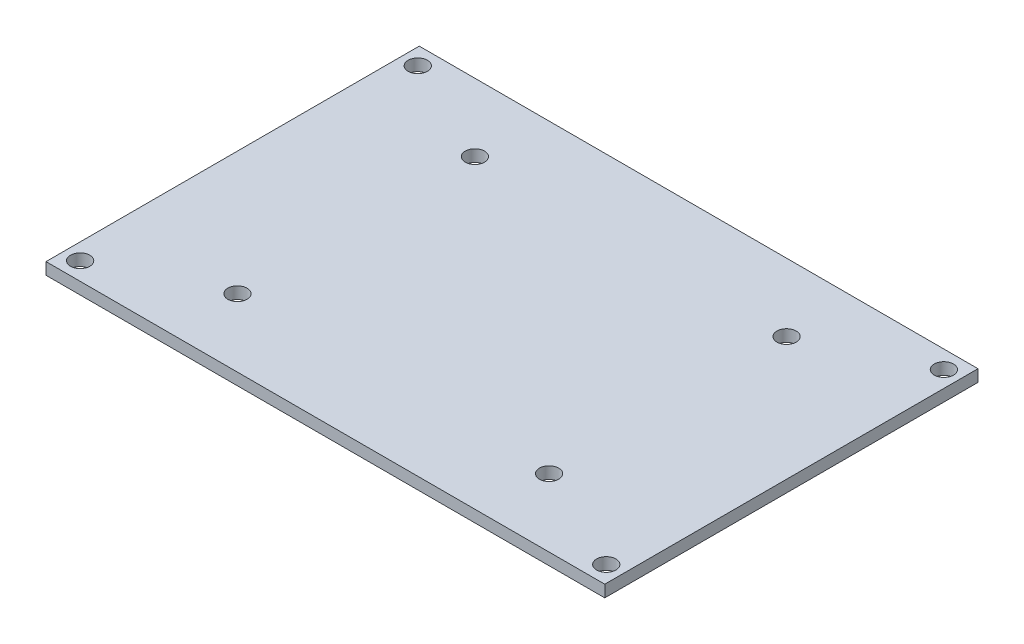
ISO-10303-21;
HEADER;
FILE_DESCRIPTION(('STEP AP214'),'2;1');
FILE_NAME('part.step','',(''),(''),'','','');
FILE_SCHEMA(('AUTOMOTIVE_DESIGN { 1 0 10303 214 1 1 1 1 }'));
ENDSEC;
DATA;
#1=APPLICATION_CONTEXT('core data for automotive mechanical design processes');
#2=APPLICATION_PROTOCOL_DEFINITION('international standard','automotive_design',2000,#1);
#3=PRODUCT_CONTEXT('',#1,'mechanical');
#4=PRODUCT('Part','Part','',(#3));
#5=PRODUCT_RELATED_PRODUCT_CATEGORY('part','',(#4));
#6=PRODUCT_DEFINITION_FORMATION('','',#4);
#7=PRODUCT_DEFINITION_CONTEXT('part definition',#1,'design');
#8=PRODUCT_DEFINITION('design','',#6,#7);
#9=PRODUCT_DEFINITION_SHAPE('','',#8);
#10=(LENGTH_UNIT() NAMED_UNIT(*) SI_UNIT(.MILLI.,.METRE.));
#11=(NAMED_UNIT(*) PLANE_ANGLE_UNIT() SI_UNIT($,.RADIAN.));
#12=(NAMED_UNIT(*) SI_UNIT($,.STERADIAN.) SOLID_ANGLE_UNIT());
#13=UNCERTAINTY_MEASURE_WITH_UNIT(LENGTH_MEASURE(1.E-05),#10,'distance_accuracy_value','');
#14=(GEOMETRIC_REPRESENTATION_CONTEXT(3) GLOBAL_UNCERTAINTY_ASSIGNED_CONTEXT((#13)) GLOBAL_UNIT_ASSIGNED_CONTEXT((#10,
#11,#12)) REPRESENTATION_CONTEXT('',''));
#15=CARTESIAN_POINT('',(0.,0.,0.));
#16=DIRECTION('',(0.,0.,1.));
#17=DIRECTION('',(1.,0.,0.));
#18=AXIS2_PLACEMENT_3D('',#15,#16,#17);
#19=CARTESIAN_POINT('',(37.65,1.6,-25.15));
#20=DIRECTION('',(-1.,0.,0.));
#21=DIRECTION('',(0.,0.,1.));
#22=AXIS2_PLACEMENT_3D('',#19,#20,#21);
#23=PLANE('',#22);
#24=DIRECTION('',(0.,0.,-1.));
#25=VECTOR('',#24,1.);
#26=CARTESIAN_POINT('',(37.65,0.,-25.15));
#27=LINE('',#26,#25);
#28=CARTESIAN_POINT('',(37.65,0.,25.15));
#29=VERTEX_POINT('',#28);
#30=CARTESIAN_POINT('',(37.65,0.,-25.15));
#31=VERTEX_POINT('',#30);
#32=EDGE_CURVE('E107',#29,#31,#27,.T.);
#33=ORIENTED_EDGE('',*,*,#32,.T.);
#34=DIRECTION('',(0.,-1.,0.));
#35=VECTOR('',#34,1.);
#36=CARTESIAN_POINT('',(37.65,1.6,-25.15));
#37=LINE('',#36,#35);
#38=CARTESIAN_POINT('',(37.65,1.6,-25.15));
#39=VERTEX_POINT('',#38);
#40=EDGE_CURVE('E11',#39,#31,#37,.T.);
#41=ORIENTED_EDGE('',*,*,#40,.F.);
#42=DIRECTION('',(0.,0.,-1.));
#43=VECTOR('',#42,1.);
#44=CARTESIAN_POINT('',(37.65,1.6,-25.15));
#45=LINE('',#44,#43);
#46=CARTESIAN_POINT('',(37.65,1.6,25.15));
#47=VERTEX_POINT('',#46);
#48=EDGE_CURVE('E91',#47,#39,#45,.T.);
#49=ORIENTED_EDGE('',*,*,#48,.F.);
#50=DIRECTION('',(0.,-1.,0.));
#51=VECTOR('',#50,1.);
#52=CARTESIAN_POINT('',(37.65,1.6,25.15));
#53=LINE('',#52,#51);
#54=EDGE_CURVE('E103',#47,#29,#53,.T.);
#55=ORIENTED_EDGE('',*,*,#54,.T.);
#56=EDGE_LOOP('',(#33,#41,#49,#55));
#57=FACE_BOUND('',#56,.T.);
#58=ADVANCED_FACE('F39',(#57),#23,.F.);
#59=CARTESIAN_POINT('',(-37.65,1.6,-25.15));
#60=DIRECTION('',(0.,0.,1.));
#61=DIRECTION('',(1.,0.,0.));
#62=AXIS2_PLACEMENT_3D('',#59,#60,#61);
#63=PLANE('',#62);
#64=DIRECTION('',(-1.,0.,0.));
#65=VECTOR('',#64,1.);
#66=CARTESIAN_POINT('',(-37.65,0.,-25.15));
#67=LINE('',#66,#65);
#68=CARTESIAN_POINT('',(-37.65,0.,-25.15));
#69=VERTEX_POINT('',#68);
#70=EDGE_CURVE('E96',#31,#69,#67,.T.);
#71=ORIENTED_EDGE('',*,*,#70,.T.);
#72=DIRECTION('',(0.,-1.,0.));
#73=VECTOR('',#72,1.);
#74=CARTESIAN_POINT('',(-37.65,1.6,-25.15));
#75=LINE('',#74,#73);
#76=CARTESIAN_POINT('',(-37.65,1.6,-25.15));
#77=VERTEX_POINT('',#76);
#78=EDGE_CURVE('E48',#77,#69,#75,.T.);
#79=ORIENTED_EDGE('',*,*,#78,.F.);
#80=DIRECTION('',(-1.,0.,0.));
#81=VECTOR('',#80,1.);
#82=CARTESIAN_POINT('',(-37.65,1.6,-25.15));
#83=LINE('',#82,#81);
#84=EDGE_CURVE('E86',#39,#77,#83,.T.);
#85=ORIENTED_EDGE('',*,*,#84,.F.);
#86=ORIENTED_EDGE('',*,*,#40,.T.);
#87=EDGE_LOOP('',(#71,#79,#85,#86));
#88=FACE_BOUND('',#87,.T.);
#89=ADVANCED_FACE('F95',(#88),#63,.F.);
#90=CARTESIAN_POINT('',(-37.65,1.6,-25.15));
#91=DIRECTION('',(1.,0.,0.));
#92=DIRECTION('',(0.,0.,-1.));
#93=AXIS2_PLACEMENT_3D('',#90,#91,#92);
#94=PLANE('',#93);
#95=DIRECTION('',(0.,0.,1.));
#96=VECTOR('',#95,1.);
#97=CARTESIAN_POINT('',(-37.65,0.,-25.15));
#98=LINE('',#97,#96);
#99=CARTESIAN_POINT('',(-37.65,0.,25.15));
#100=VERTEX_POINT('',#99);
#101=EDGE_CURVE('E73',#69,#100,#98,.T.);
#102=ORIENTED_EDGE('',*,*,#101,.T.);
#103=DIRECTION('',(0.,-1.,0.));
#104=VECTOR('',#103,1.);
#105=CARTESIAN_POINT('',(-37.65,1.6,25.15));
#106=LINE('',#105,#104);
#107=CARTESIAN_POINT('',(-37.65,1.6,25.15));
#108=VERTEX_POINT('',#107);
#109=EDGE_CURVE('E98',#108,#100,#106,.T.);
#110=ORIENTED_EDGE('',*,*,#109,.F.);
#111=DIRECTION('',(0.,0.,1.));
#112=VECTOR('',#111,1.);
#113=CARTESIAN_POINT('',(-37.65,1.6,-25.15));
#114=LINE('',#113,#112);
#115=EDGE_CURVE('E89',#77,#108,#114,.T.);
#116=ORIENTED_EDGE('',*,*,#115,.F.);
#117=ORIENTED_EDGE('',*,*,#78,.T.);
#118=EDGE_LOOP('',(#102,#110,#116,#117));
#119=FACE_BOUND('',#118,.T.);
#120=ADVANCED_FACE('F99',(#119),#94,.F.);
#121=CARTESIAN_POINT('',(-37.65,1.6,25.15));
#122=DIRECTION('',(0.,0.,-1.));
#123=DIRECTION('',(-1.,0.,0.));
#124=AXIS2_PLACEMENT_3D('',#121,#122,#123);
#125=PLANE('',#124);
#126=DIRECTION('',(1.,0.,0.));
#127=VECTOR('',#126,1.);
#128=CARTESIAN_POINT('',(-37.65,0.,25.15));
#129=LINE('',#128,#127);
#130=EDGE_CURVE('E79',#100,#29,#129,.T.);
#131=ORIENTED_EDGE('',*,*,#130,.T.);
#132=ORIENTED_EDGE('',*,*,#54,.F.);
#133=DIRECTION('',(1.,0.,0.));
#134=VECTOR('',#133,1.);
#135=CARTESIAN_POINT('',(-37.65,1.6,25.15));
#136=LINE('',#135,#134);
#137=EDGE_CURVE('E56',#108,#47,#136,.T.);
#138=ORIENTED_EDGE('',*,*,#137,.F.);
#139=ORIENTED_EDGE('',*,*,#109,.T.);
#140=EDGE_LOOP('',(#131,#132,#138,#139));
#141=FACE_BOUND('',#140,.T.);
#142=ADVANCED_FACE('F121',(#141),#125,.F.);
#143=CARTESIAN_POINT('',(0.,1.6,0.));
#144=DIRECTION('',(0.,1.,0.));
#145=DIRECTION('',(0.,0.,1.));
#146=AXIS2_PLACEMENT_3D('',#143,#144,#145);
#147=PLANE('',#146);
#148=CARTESIAN_POINT('',(-21.,1.6,-16.));
#149=DIRECTION('',(0.,1.,0.));
#150=DIRECTION('',(0.,0.,1.));
#151=AXIS2_PLACEMENT_3D('',#148,#149,#150);
#152=CIRCLE('',#151,1.29999999999999);
#153=CARTESIAN_POINT('',(-21.,1.6,-14.7));
#154=VERTEX_POINT('',#153);
#155=EDGE_CURVE('E187',#154,#154,#152,.T.);
#156=ORIENTED_EDGE('',*,*,#155,.F.);
#157=EDGE_LOOP('',(#156));
#158=FACE_BOUND('',#157,.T.);
#159=CARTESIAN_POINT('',(21.,1.6,-16.));
#160=DIRECTION('',(0.,1.,0.));
#161=DIRECTION('',(0.,0.,1.));
#162=AXIS2_PLACEMENT_3D('',#159,#160,#161);
#163=CIRCLE('',#162,1.29999999999999);
#164=CARTESIAN_POINT('',(21.,1.6,-14.7));
#165=VERTEX_POINT('',#164);
#166=EDGE_CURVE('E179',#165,#165,#163,.T.);
#167=ORIENTED_EDGE('',*,*,#166,.F.);
#168=EDGE_LOOP('',(#167));
#169=FACE_BOUND('',#168,.T.);
#170=CARTESIAN_POINT('',(21.,1.6,16.));
#171=DIRECTION('',(0.,1.,0.));
#172=DIRECTION('',(0.,0.,1.));
#173=AXIS2_PLACEMENT_3D('',#170,#171,#172);
#174=CIRCLE('',#173,1.29999999999999);
#175=CARTESIAN_POINT('',(21.,1.6,17.3));
#176=VERTEX_POINT('',#175);
#177=EDGE_CURVE('E171',#176,#176,#174,.T.);
#178=ORIENTED_EDGE('',*,*,#177,.F.);
#179=EDGE_LOOP('',(#178));
#180=FACE_BOUND('',#179,.T.);
#181=CARTESIAN_POINT('',(-21.,1.6,16.));
#182=DIRECTION('',(0.,1.,0.));
#183=DIRECTION('',(0.,0.,1.));
#184=AXIS2_PLACEMENT_3D('',#181,#182,#183);
#185=CIRCLE('',#184,1.29999999999999);
#186=CARTESIAN_POINT('',(-21.,1.6,17.3));
#187=VERTEX_POINT('',#186);
#188=EDGE_CURVE('E163',#187,#187,#185,.T.);
#189=ORIENTED_EDGE('',*,*,#188,.F.);
#190=EDGE_LOOP('',(#189));
#191=FACE_BOUND('',#190,.T.);
#192=CARTESIAN_POINT('',(-35.45,1.6,-22.75));
#193=DIRECTION('',(0.,1.,0.));
#194=DIRECTION('',(0.,0.,1.));
#195=AXIS2_PLACEMENT_3D('',#192,#193,#194);
#196=CIRCLE('',#195,1.29999999999999);
#197=CARTESIAN_POINT('',(-35.45,1.6,-21.45));
#198=VERTEX_POINT('',#197);
#199=EDGE_CURVE('E155',#198,#198,#196,.T.);
#200=ORIENTED_EDGE('',*,*,#199,.F.);
#201=EDGE_LOOP('',(#200));
#202=FACE_BOUND('',#201,.T.);
#203=CARTESIAN_POINT('',(35.45,1.6,-22.75));
#204=DIRECTION('',(0.,1.,0.));
#205=DIRECTION('',(0.,0.,1.));
#206=AXIS2_PLACEMENT_3D('',#203,#204,#205);
#207=CIRCLE('',#206,1.29999999999999);
#208=CARTESIAN_POINT('',(35.45,1.6,-21.45));
#209=VERTEX_POINT('',#208);
#210=EDGE_CURVE('E147',#209,#209,#207,.T.);
#211=ORIENTED_EDGE('',*,*,#210,.F.);
#212=EDGE_LOOP('',(#211));
#213=FACE_BOUND('',#212,.T.);
#214=CARTESIAN_POINT('',(35.45,1.6,22.75));
#215=DIRECTION('',(0.,1.,0.));
#216=DIRECTION('',(0.,0.,1.));
#217=AXIS2_PLACEMENT_3D('',#214,#215,#216);
#218=CIRCLE('',#217,1.29999999999999);
#219=CARTESIAN_POINT('',(35.45,1.6,24.05));
#220=VERTEX_POINT('',#219);
#221=EDGE_CURVE('E139',#220,#220,#218,.T.);
#222=ORIENTED_EDGE('',*,*,#221,.F.);
#223=EDGE_LOOP('',(#222));
#224=FACE_BOUND('',#223,.T.);
#225=CARTESIAN_POINT('',(-35.45,1.6,22.75));
#226=DIRECTION('',(0.,1.,0.));
#227=DIRECTION('',(0.,0.,1.));
#228=AXIS2_PLACEMENT_3D('',#225,#226,#227);
#229=CIRCLE('',#228,1.29999999999999);
#230=CARTESIAN_POINT('',(-35.45,1.6,24.05));
#231=VERTEX_POINT('',#230);
#232=EDGE_CURVE('E131',#231,#231,#229,.T.);
#233=ORIENTED_EDGE('',*,*,#232,.F.);
#234=EDGE_LOOP('',(#233));
#235=FACE_BOUND('',#234,.T.);
#236=ORIENTED_EDGE('',*,*,#48,.T.);
#237=ORIENTED_EDGE('',*,*,#84,.T.);
#238=ORIENTED_EDGE('',*,*,#115,.T.);
#239=ORIENTED_EDGE('',*,*,#137,.T.);
#240=EDGE_LOOP('',(#236,#237,#238,#239));
#241=FACE_BOUND('',#240,.T.);
#242=ADVANCED_FACE('F87',(#158,#169,#180,#191,#202,#213,#224,#235,#241),#147,.T.);
#243=CARTESIAN_POINT('',(0.,0.,0.));
#244=DIRECTION('',(0.,1.,0.));
#245=DIRECTION('',(0.,0.,1.));
#246=AXIS2_PLACEMENT_3D('',#243,#244,#245);
#247=PLANE('',#246);
#248=CARTESIAN_POINT('',(-21.,0.,-16.));
#249=DIRECTION('',(0.,1.,0.));
#250=DIRECTION('',(0.,0.,1.));
#251=AXIS2_PLACEMENT_3D('',#248,#249,#250);
#252=CIRCLE('',#251,1.3);
#253=CARTESIAN_POINT('',(-21.,0.,-14.7));
#254=VERTEX_POINT('',#253);
#255=EDGE_CURVE('E183',#254,#254,#252,.T.);
#256=ORIENTED_EDGE('',*,*,#255,.T.);
#257=EDGE_LOOP('',(#256));
#258=FACE_BOUND('',#257,.T.);
#259=CARTESIAN_POINT('',(21.,0.,-16.));
#260=DIRECTION('',(0.,1.,0.));
#261=DIRECTION('',(0.,0.,1.));
#262=AXIS2_PLACEMENT_3D('',#259,#260,#261);
#263=CIRCLE('',#262,1.3);
#264=CARTESIAN_POINT('',(21.,0.,-14.7));
#265=VERTEX_POINT('',#264);
#266=EDGE_CURVE('E175',#265,#265,#263,.T.);
#267=ORIENTED_EDGE('',*,*,#266,.T.);
#268=EDGE_LOOP('',(#267));
#269=FACE_BOUND('',#268,.T.);
#270=CARTESIAN_POINT('',(21.,0.,16.));
#271=DIRECTION('',(0.,1.,0.));
#272=DIRECTION('',(0.,0.,1.));
#273=AXIS2_PLACEMENT_3D('',#270,#271,#272);
#274=CIRCLE('',#273,1.3);
#275=CARTESIAN_POINT('',(21.,0.,17.3));
#276=VERTEX_POINT('',#275);
#277=EDGE_CURVE('E167',#276,#276,#274,.T.);
#278=ORIENTED_EDGE('',*,*,#277,.T.);
#279=EDGE_LOOP('',(#278));
#280=FACE_BOUND('',#279,.T.);
#281=CARTESIAN_POINT('',(-21.,0.,16.));
#282=DIRECTION('',(0.,1.,0.));
#283=DIRECTION('',(0.,0.,1.));
#284=AXIS2_PLACEMENT_3D('',#281,#282,#283);
#285=CIRCLE('',#284,1.3);
#286=CARTESIAN_POINT('',(-21.,0.,17.3));
#287=VERTEX_POINT('',#286);
#288=EDGE_CURVE('E159',#287,#287,#285,.T.);
#289=ORIENTED_EDGE('',*,*,#288,.T.);
#290=EDGE_LOOP('',(#289));
#291=FACE_BOUND('',#290,.T.);
#292=CARTESIAN_POINT('',(-35.45,0.,-22.75));
#293=DIRECTION('',(0.,1.,0.));
#294=DIRECTION('',(0.,0.,1.));
#295=AXIS2_PLACEMENT_3D('',#292,#293,#294);
#296=CIRCLE('',#295,1.3);
#297=CARTESIAN_POINT('',(-35.45,0.,-21.45));
#298=VERTEX_POINT('',#297);
#299=EDGE_CURVE('E151',#298,#298,#296,.T.);
#300=ORIENTED_EDGE('',*,*,#299,.T.);
#301=EDGE_LOOP('',(#300));
#302=FACE_BOUND('',#301,.T.);
#303=CARTESIAN_POINT('',(35.45,0.,-22.75));
#304=DIRECTION('',(0.,1.,0.));
#305=DIRECTION('',(0.,0.,1.));
#306=AXIS2_PLACEMENT_3D('',#303,#304,#305);
#307=CIRCLE('',#306,1.3);
#308=CARTESIAN_POINT('',(35.45,0.,-21.45));
#309=VERTEX_POINT('',#308);
#310=EDGE_CURVE('E143',#309,#309,#307,.T.);
#311=ORIENTED_EDGE('',*,*,#310,.T.);
#312=EDGE_LOOP('',(#311));
#313=FACE_BOUND('',#312,.T.);
#314=CARTESIAN_POINT('',(35.45,0.,22.75));
#315=DIRECTION('',(0.,1.,0.));
#316=DIRECTION('',(0.,0.,1.));
#317=AXIS2_PLACEMENT_3D('',#314,#315,#316);
#318=CIRCLE('',#317,1.3);
#319=CARTESIAN_POINT('',(35.45,0.,24.05));
#320=VERTEX_POINT('',#319);
#321=EDGE_CURVE('E135',#320,#320,#318,.T.);
#322=ORIENTED_EDGE('',*,*,#321,.T.);
#323=EDGE_LOOP('',(#322));
#324=FACE_BOUND('',#323,.T.);
#325=CARTESIAN_POINT('',(-35.45,0.,22.75));
#326=DIRECTION('',(0.,1.,0.));
#327=DIRECTION('',(0.,0.,1.));
#328=AXIS2_PLACEMENT_3D('',#325,#326,#327);
#329=CIRCLE('',#328,1.3);
#330=CARTESIAN_POINT('',(-35.45,0.,24.05));
#331=VERTEX_POINT('',#330);
#332=EDGE_CURVE('E111',#331,#331,#329,.T.);
#333=ORIENTED_EDGE('',*,*,#332,.T.);
#334=EDGE_LOOP('',(#333));
#335=FACE_BOUND('',#334,.T.);
#336=ORIENTED_EDGE('',*,*,#32,.F.);
#337=ORIENTED_EDGE('',*,*,#130,.F.);
#338=ORIENTED_EDGE('',*,*,#101,.F.);
#339=ORIENTED_EDGE('',*,*,#70,.F.);
#340=EDGE_LOOP('',(#336,#337,#338,#339));
#341=FACE_BOUND('',#340,.T.);
#342=ADVANCED_FACE('F124',(#258,#269,#280,#291,#302,#313,#324,#335,#341),#247,.F.);
#343=CARTESIAN_POINT('',(-35.45,1.6,22.75));
#344=DIRECTION('',(0.,1.,0.));
#345=DIRECTION('',(0.,0.,1.));
#346=AXIS2_PLACEMENT_3D('',#343,#344,#345);
#347=CYLINDRICAL_SURFACE('',#346,1.29999999999999);
#348=ORIENTED_EDGE('',*,*,#332,.F.);
#349=EDGE_LOOP('',(#348));
#350=FACE_BOUND('',#349,.T.);
#351=ORIENTED_EDGE('',*,*,#232,.T.);
#352=EDGE_LOOP('',(#351));
#353=FACE_BOUND('',#352,.T.);
#354=ADVANCED_FACE('F211',(#350,#353),#347,.F.);
#355=CARTESIAN_POINT('',(35.45,1.6,22.75));
#356=DIRECTION('',(0.,1.,0.));
#357=DIRECTION('',(0.,0.,1.));
#358=AXIS2_PLACEMENT_3D('',#355,#356,#357);
#359=CYLINDRICAL_SURFACE('',#358,1.3);
#360=ORIENTED_EDGE('',*,*,#321,.F.);
#361=EDGE_LOOP('',(#360));
#362=FACE_BOUND('',#361,.T.);
#363=ORIENTED_EDGE('',*,*,#221,.T.);
#364=EDGE_LOOP('',(#363));
#365=FACE_BOUND('',#364,.T.);
#366=ADVANCED_FACE('F213',(#362,#365),#359,.F.);
#367=CARTESIAN_POINT('',(35.45,1.6,-22.75));
#368=DIRECTION('',(0.,1.,0.));
#369=DIRECTION('',(0.,0.,1.));
#370=AXIS2_PLACEMENT_3D('',#367,#368,#369);
#371=CYLINDRICAL_SURFACE('',#370,1.29999999999999);
#372=ORIENTED_EDGE('',*,*,#310,.F.);
#373=EDGE_LOOP('',(#372));
#374=FACE_BOUND('',#373,.T.);
#375=ORIENTED_EDGE('',*,*,#210,.T.);
#376=EDGE_LOOP('',(#375));
#377=FACE_BOUND('',#376,.T.);
#378=ADVANCED_FACE('F220',(#374,#377),#371,.F.);
#379=CARTESIAN_POINT('',(-35.45,1.6,-22.75));
#380=DIRECTION('',(0.,1.,0.));
#381=DIRECTION('',(0.,0.,1.));
#382=AXIS2_PLACEMENT_3D('',#379,#380,#381);
#383=CYLINDRICAL_SURFACE('',#382,1.29999999999999);
#384=ORIENTED_EDGE('',*,*,#299,.F.);
#385=EDGE_LOOP('',(#384));
#386=FACE_BOUND('',#385,.T.);
#387=ORIENTED_EDGE('',*,*,#199,.T.);
#388=EDGE_LOOP('',(#387));
#389=FACE_BOUND('',#388,.T.);
#390=ADVANCED_FACE('F261',(#386,#389),#383,.F.);
#391=CARTESIAN_POINT('',(-21.,1.6,16.));
#392=DIRECTION('',(0.,1.,0.));
#393=DIRECTION('',(0.,0.,1.));
#394=AXIS2_PLACEMENT_3D('',#391,#392,#393);
#395=CYLINDRICAL_SURFACE('',#394,1.29999999999999);
#396=ORIENTED_EDGE('',*,*,#288,.F.);
#397=EDGE_LOOP('',(#396));
#398=FACE_BOUND('',#397,.T.);
#399=ORIENTED_EDGE('',*,*,#188,.T.);
#400=EDGE_LOOP('',(#399));
#401=FACE_BOUND('',#400,.T.);
#402=ADVANCED_FACE('F255',(#398,#401),#395,.F.);
#403=CARTESIAN_POINT('',(21.,1.6,16.));
#404=DIRECTION('',(0.,1.,0.));
#405=DIRECTION('',(0.,0.,1.));
#406=AXIS2_PLACEMENT_3D('',#403,#404,#405);
#407=CYLINDRICAL_SURFACE('',#406,1.29999999999999);
#408=ORIENTED_EDGE('',*,*,#277,.F.);
#409=EDGE_LOOP('',(#408));
#410=FACE_BOUND('',#409,.T.);
#411=ORIENTED_EDGE('',*,*,#177,.T.);
#412=EDGE_LOOP('',(#411));
#413=FACE_BOUND('',#412,.T.);
#414=ADVANCED_FACE('F260',(#410,#413),#407,.F.);
#415=CARTESIAN_POINT('',(21.,1.6,-16.));
#416=DIRECTION('',(0.,1.,0.));
#417=DIRECTION('',(0.,0.,1.));
#418=AXIS2_PLACEMENT_3D('',#415,#416,#417);
#419=CYLINDRICAL_SURFACE('',#418,1.29999999999999);
#420=ORIENTED_EDGE('',*,*,#266,.F.);
#421=EDGE_LOOP('',(#420));
#422=FACE_BOUND('',#421,.T.);
#423=ORIENTED_EDGE('',*,*,#166,.T.);
#424=EDGE_LOOP('',(#423));
#425=FACE_BOUND('',#424,.T.);
#426=ADVANCED_FACE('F273',(#422,#425),#419,.F.);
#427=CARTESIAN_POINT('',(-21.,1.6,-16.));
#428=DIRECTION('',(0.,1.,0.));
#429=DIRECTION('',(0.,0.,1.));
#430=AXIS2_PLACEMENT_3D('',#427,#428,#429);
#431=CYLINDRICAL_SURFACE('',#430,1.29999999999999);
#432=ORIENTED_EDGE('',*,*,#255,.F.);
#433=EDGE_LOOP('',(#432));
#434=FACE_BOUND('',#433,.T.);
#435=ORIENTED_EDGE('',*,*,#155,.T.);
#436=EDGE_LOOP('',(#435));
#437=FACE_BOUND('',#436,.T.);
#438=ADVANCED_FACE('F192',(#434,#437),#431,.F.);
#439=CLOSED_SHELL('',(#58,#89,#120,#142,#242,#342,#354,#366,#378,#390,#402,#414,#426,#438));
#440=MANIFOLD_SOLID_BREP('B2',#439);
#441=ADVANCED_BREP_SHAPE_REPRESENTATION('',(#18,#440),#14);
#442=SHAPE_DEFINITION_REPRESENTATION(#9,#441);
ENDSEC;
END-ISO-10303-21;
